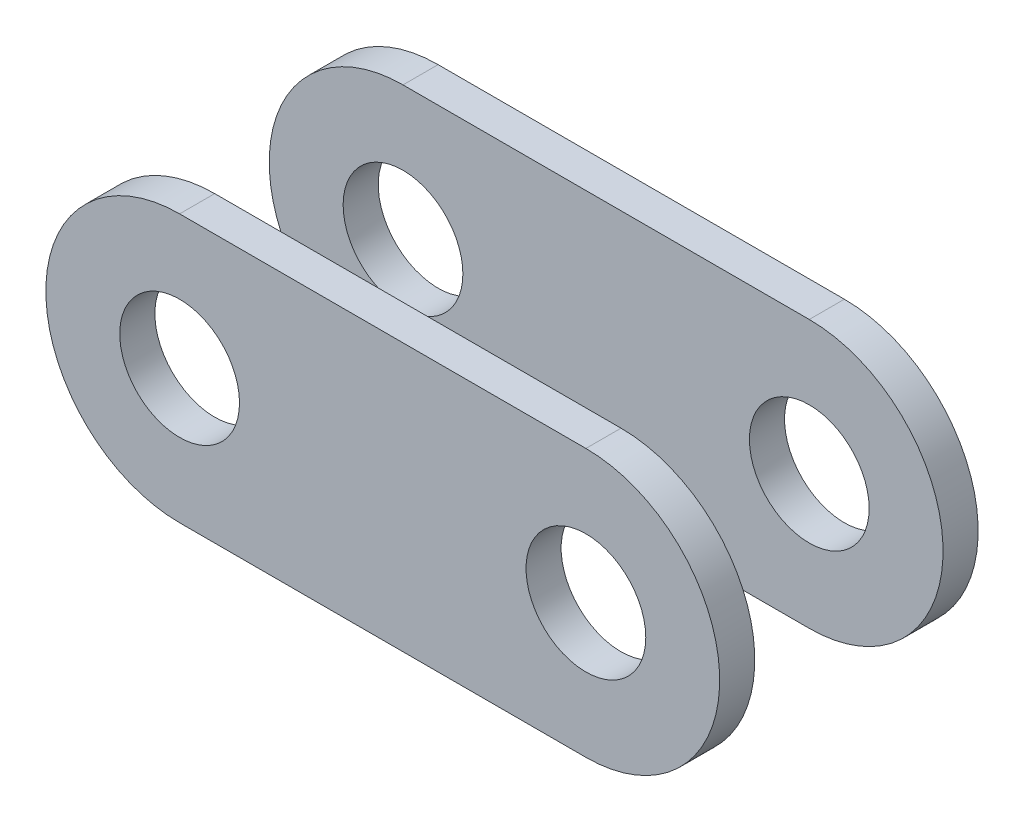
ISO-10303-21;
HEADER;
FILE_DESCRIPTION(('STEP AP214'),'2;1');
FILE_NAME('part.step','',(''),(''),'','','');
FILE_SCHEMA(('AUTOMOTIVE_DESIGN { 1 0 10303 214 1 1 1 1 }'));
ENDSEC;
DATA;
#1=APPLICATION_CONTEXT('core data for automotive mechanical design processes');
#2=APPLICATION_PROTOCOL_DEFINITION('international standard','automotive_design',2000,#1);
#3=PRODUCT_CONTEXT('',#1,'mechanical');
#4=PRODUCT('Part','Part','',(#3));
#5=PRODUCT_RELATED_PRODUCT_CATEGORY('part','',(#4));
#6=PRODUCT_DEFINITION_FORMATION('','',#4);
#7=PRODUCT_DEFINITION_CONTEXT('part definition',#1,'design');
#8=PRODUCT_DEFINITION('design','',#6,#7);
#9=PRODUCT_DEFINITION_SHAPE('','',#8);
#10=(LENGTH_UNIT() NAMED_UNIT(*) SI_UNIT(.MILLI.,.METRE.));
#11=(NAMED_UNIT(*) PLANE_ANGLE_UNIT() SI_UNIT($,.RADIAN.));
#12=(NAMED_UNIT(*) SI_UNIT($,.STERADIAN.) SOLID_ANGLE_UNIT());
#13=UNCERTAINTY_MEASURE_WITH_UNIT(LENGTH_MEASURE(1.E-05),#10,'distance_accuracy_value','');
#14=(GEOMETRIC_REPRESENTATION_CONTEXT(3) GLOBAL_UNCERTAINTY_ASSIGNED_CONTEXT((#13)) GLOBAL_UNIT_ASSIGNED_CONTEXT((#10,
#11,#12)) REPRESENTATION_CONTEXT('',''));
#15=CARTESIAN_POINT('',(0.,0.,0.));
#16=DIRECTION('',(0.,0.,1.));
#17=DIRECTION('',(1.,0.,0.));
#18=AXIS2_PLACEMENT_3D('',#15,#16,#17);
#19=CARTESIAN_POINT('',(-9.46580774929193,0.,-3.9751));
#20=DIRECTION('',(0.,0.,1.));
#21=DIRECTION('',(1.,0.,0.));
#22=AXIS2_PLACEMENT_3D('',#19,#20,#21);
#23=CYLINDRICAL_SURFACE('',#22,4.1148);
#24=CARTESIAN_POINT('',(-9.46580774929193,0.,-2.8956));
#25=DIRECTION('',(0.,0.,-1.));
#26=DIRECTION('',(-1.,0.,0.));
#27=AXIS2_PLACEMENT_3D('',#24,#25,#26);
#28=CIRCLE('',#27,4.1148);
#29=CARTESIAN_POINT('',(-9.46580774929193,4.1148,-2.8956));
#30=VERTEX_POINT('',#29);
#31=CARTESIAN_POINT('',(-9.46580774929193,-4.1148,-2.8956));
#32=VERTEX_POINT('',#31);
#33=EDGE_CURVE('E59',#30,#32,#28,.F.);
#34=ORIENTED_EDGE('',*,*,#33,.F.);
#35=DIRECTION('',(0.,0.,1.));
#36=VECTOR('',#35,1.);
#37=CARTESIAN_POINT('',(-9.46580774929193,4.1148,-3.9751));
#38=LINE('',#37,#36);
#39=CARTESIAN_POINT('',(-9.46580774929193,4.1148,-3.9751));
#40=VERTEX_POINT('',#39);
#41=EDGE_CURVE('E101',#40,#30,#38,.T.);
#42=ORIENTED_EDGE('',*,*,#41,.F.);
#43=CARTESIAN_POINT('',(-9.46580774929193,0.,-3.9751));
#44=DIRECTION('',(0.,0.,1.));
#45=DIRECTION('',(1.,0.,0.));
#46=AXIS2_PLACEMENT_3D('',#43,#44,#45);
#47=CIRCLE('',#46,4.1148);
#48=CARTESIAN_POINT('',(-9.46580774929193,-4.1148,-3.9751));
#49=VERTEX_POINT('',#48);
#50=EDGE_CURVE('E98',#40,#49,#47,.T.);
#51=ORIENTED_EDGE('',*,*,#50,.T.);
#52=DIRECTION('',(0.,0.,1.));
#53=VECTOR('',#52,1.);
#54=CARTESIAN_POINT('',(-9.46580774929193,-4.1148,-3.9751));
#55=LINE('',#54,#53);
#56=EDGE_CURVE('E46',#49,#32,#55,.T.);
#57=ORIENTED_EDGE('',*,*,#56,.T.);
#58=EDGE_LOOP('',(#34,#42,#51,#57));
#59=FACE_BOUND('',#58,.T.);
#60=ADVANCED_FACE('F42',(#59),#23,.T.);
#61=CARTESIAN_POINT('',(-9.46580774929193,4.1148,-3.9751));
#62=DIRECTION('',(0.,1.,0.));
#63=DIRECTION('',(0.,0.,1.));
#64=AXIS2_PLACEMENT_3D('',#61,#62,#63);
#65=PLANE('',#64);
#66=DIRECTION('',(-1.,0.,0.));
#67=VECTOR('',#66,1.);
#68=CARTESIAN_POINT('',(-13.5806077492919,4.1148,-2.8956));
#69=LINE('',#68,#67);
#70=CARTESIAN_POINT('',(3.03099225070807,4.1148,-2.8956));
#71=VERTEX_POINT('',#70);
#72=EDGE_CURVE('E12',#71,#30,#69,.T.);
#73=ORIENTED_EDGE('',*,*,#72,.F.);
#74=DIRECTION('',(0.,0.,1.));
#75=VECTOR('',#74,1.);
#76=CARTESIAN_POINT('',(3.03099225070807,4.1148,-3.9751));
#77=LINE('',#76,#75);
#78=CARTESIAN_POINT('',(3.03099225070807,4.1148,-3.9751));
#79=VERTEX_POINT('',#78);
#80=EDGE_CURVE('E94',#79,#71,#77,.T.);
#81=ORIENTED_EDGE('',*,*,#80,.F.);
#82=DIRECTION('',(-1.,0.,0.));
#83=VECTOR('',#82,1.);
#84=CARTESIAN_POINT('',(-9.46580774929193,4.1148,-3.9751));
#85=LINE('',#84,#83);
#86=EDGE_CURVE('E99',#79,#40,#85,.T.);
#87=ORIENTED_EDGE('',*,*,#86,.T.);
#88=ORIENTED_EDGE('',*,*,#41,.T.);
#89=EDGE_LOOP('',(#73,#81,#87,#88));
#90=FACE_BOUND('',#89,.T.);
#91=ADVANCED_FACE('F148',(#90),#65,.T.);
#92=CARTESIAN_POINT('',(3.03099225070807,0.,-3.9751));
#93=DIRECTION('',(0.,0.,1.));
#94=DIRECTION('',(1.,0.,0.));
#95=AXIS2_PLACEMENT_3D('',#92,#93,#94);
#96=CYLINDRICAL_SURFACE('',#95,4.1148);
#97=CARTESIAN_POINT('',(3.03099225070807,0.,-2.8956));
#98=DIRECTION('',(0.,0.,-1.));
#99=DIRECTION('',(-1.,0.,0.));
#100=AXIS2_PLACEMENT_3D('',#97,#98,#99);
#101=CIRCLE('',#100,4.1148);
#102=CARTESIAN_POINT('',(3.03099225070807,-4.1148,-2.8956));
#103=VERTEX_POINT('',#102);
#104=EDGE_CURVE('E52',#103,#71,#101,.F.);
#105=ORIENTED_EDGE('',*,*,#104,.F.);
#106=DIRECTION('',(0.,0.,1.));
#107=VECTOR('',#106,1.);
#108=CARTESIAN_POINT('',(3.03099225070807,-4.1148,-3.9751));
#109=LINE('',#108,#107);
#110=CARTESIAN_POINT('',(3.03099225070807,-4.1148,-3.9751));
#111=VERTEX_POINT('',#110);
#112=EDGE_CURVE('E92',#111,#103,#109,.T.);
#113=ORIENTED_EDGE('',*,*,#112,.F.);
#114=CARTESIAN_POINT('',(3.03099225070807,0.,-3.9751));
#115=DIRECTION('',(0.,0.,1.));
#116=DIRECTION('',(1.,0.,0.));
#117=AXIS2_PLACEMENT_3D('',#114,#115,#116);
#118=CIRCLE('',#117,4.1148);
#119=EDGE_CURVE('E118',#111,#79,#118,.T.);
#120=ORIENTED_EDGE('',*,*,#119,.T.);
#121=ORIENTED_EDGE('',*,*,#80,.T.);
#122=EDGE_LOOP('',(#105,#113,#120,#121));
#123=FACE_BOUND('',#122,.T.);
#124=ADVANCED_FACE('F153',(#123),#96,.T.);
#125=CARTESIAN_POINT('',(-9.46580774929193,-4.1148,-3.9751));
#126=DIRECTION('',(0.,-1.,0.));
#127=DIRECTION('',(0.,0.,-1.));
#128=AXIS2_PLACEMENT_3D('',#125,#126,#127);
#129=PLANE('',#128);
#130=DIRECTION('',(-1.,0.,0.));
#131=VECTOR('',#130,1.);
#132=CARTESIAN_POINT('',(-13.5806077492919,-4.1148,-2.8956));
#133=LINE('',#132,#131);
#134=EDGE_CURVE('E81',#103,#32,#133,.T.);
#135=ORIENTED_EDGE('',*,*,#134,.T.);
#136=ORIENTED_EDGE('',*,*,#56,.F.);
#137=DIRECTION('',(1.,0.,0.));
#138=VECTOR('',#137,1.);
#139=CARTESIAN_POINT('',(-9.46580774929193,-4.1148,-3.9751));
#140=LINE('',#139,#138);
#141=EDGE_CURVE('E93',#49,#111,#140,.T.);
#142=ORIENTED_EDGE('',*,*,#141,.T.);
#143=ORIENTED_EDGE('',*,*,#112,.T.);
#144=EDGE_LOOP('',(#135,#136,#142,#143));
#145=FACE_BOUND('',#144,.T.);
#146=ADVANCED_FACE('F89',(#145),#129,.T.);
#147=CARTESIAN_POINT('',(-9.46580774929193,0.,-3.9751));
#148=DIRECTION('',(0.,0.,1.));
#149=DIRECTION('',(1.,0.,0.));
#150=AXIS2_PLACEMENT_3D('',#147,#148,#149);
#151=CYLINDRICAL_SURFACE('',#150,1.8415);
#152=CARTESIAN_POINT('',(-9.46580774929193,0.,-2.8956));
#153=DIRECTION('',(0.,0.,-1.));
#154=DIRECTION('',(-1.,0.,0.));
#155=AXIS2_PLACEMENT_3D('',#152,#153,#154);
#156=CIRCLE('',#155,1.8415);
#157=CARTESIAN_POINT('',(-11.3073077492919,0.,-2.8956));
#158=VERTEX_POINT('',#157);
#159=EDGE_CURVE('E114',#158,#158,#156,.F.);
#160=ORIENTED_EDGE('',*,*,#159,.T.);
#161=EDGE_LOOP('',(#160));
#162=FACE_BOUND('',#161,.T.);
#163=CARTESIAN_POINT('',(-9.46580774929193,0.,-3.9751));
#164=DIRECTION('',(0.,0.,1.));
#165=DIRECTION('',(1.,0.,0.));
#166=AXIS2_PLACEMENT_3D('',#163,#164,#165);
#167=CIRCLE('',#166,1.8415);
#168=CARTESIAN_POINT('',(-7.62430774929193,0.,-3.9751));
#169=VERTEX_POINT('',#168);
#170=EDGE_CURVE('E85',#169,#169,#167,.T.);
#171=ORIENTED_EDGE('',*,*,#170,.F.);
#172=EDGE_LOOP('',(#171));
#173=FACE_BOUND('',#172,.T.);
#174=ADVANCED_FACE('F136',(#162,#173),#151,.F.);
#175=CARTESIAN_POINT('',(3.03099225070807,0.,-3.9751));
#176=DIRECTION('',(0.,0.,1.));
#177=DIRECTION('',(1.,0.,0.));
#178=AXIS2_PLACEMENT_3D('',#175,#176,#177);
#179=CYLINDRICAL_SURFACE('',#178,1.8415);
#180=CARTESIAN_POINT('',(3.03099225070807,0.,-2.8956));
#181=DIRECTION('',(0.,0.,-1.));
#182=DIRECTION('',(-1.,0.,0.));
#183=AXIS2_PLACEMENT_3D('',#180,#181,#182);
#184=CIRCLE('',#183,1.8415);
#185=CARTESIAN_POINT('',(1.18949225070807,0.,-2.8956));
#186=VERTEX_POINT('',#185);
#187=EDGE_CURVE('E111',#186,#186,#184,.F.);
#188=ORIENTED_EDGE('',*,*,#187,.T.);
#189=EDGE_LOOP('',(#188));
#190=FACE_BOUND('',#189,.T.);
#191=CARTESIAN_POINT('',(3.03099225070807,0.,-3.9751));
#192=DIRECTION('',(0.,0.,1.));
#193=DIRECTION('',(1.,0.,0.));
#194=AXIS2_PLACEMENT_3D('',#191,#192,#193);
#195=CIRCLE('',#194,1.8415);
#196=CARTESIAN_POINT('',(4.87249225070807,0.,-3.9751));
#197=VERTEX_POINT('',#196);
#198=EDGE_CURVE('E109',#197,#197,#195,.T.);
#199=ORIENTED_EDGE('',*,*,#198,.F.);
#200=EDGE_LOOP('',(#199));
#201=FACE_BOUND('',#200,.T.);
#202=ADVANCED_FACE('F44',(#190,#201),#179,.F.);
#203=CARTESIAN_POINT('',(-9.46580774929193,0.,-3.9751));
#204=DIRECTION('',(0.,0.,1.));
#205=DIRECTION('',(1.,0.,0.));
#206=AXIS2_PLACEMENT_3D('',#203,#204,#205);
#207=PLANE('',#206);
#208=ORIENTED_EDGE('',*,*,#198,.T.);
#209=EDGE_LOOP('',(#208));
#210=FACE_BOUND('',#209,.T.);
#211=ORIENTED_EDGE('',*,*,#170,.T.);
#212=EDGE_LOOP('',(#211));
#213=FACE_BOUND('',#212,.T.);
#214=ORIENTED_EDGE('',*,*,#50,.F.);
#215=ORIENTED_EDGE('',*,*,#86,.F.);
#216=ORIENTED_EDGE('',*,*,#119,.F.);
#217=ORIENTED_EDGE('',*,*,#141,.F.);
#218=EDGE_LOOP('',(#214,#215,#216,#217));
#219=FACE_BOUND('',#218,.T.);
#220=ADVANCED_FACE('F122',(#210,#213,#219),#207,.F.);
#221=CARTESIAN_POINT('',(-13.5806077492919,-4.1148,-2.8956));
#222=DIRECTION('',(0.,0.,-1.));
#223=DIRECTION('',(-1.,0.,0.));
#224=AXIS2_PLACEMENT_3D('',#221,#222,#223);
#225=PLANE('',#224);
#226=ORIENTED_EDGE('',*,*,#33,.T.);
#227=ORIENTED_EDGE('',*,*,#134,.F.);
#228=ORIENTED_EDGE('',*,*,#104,.T.);
#229=ORIENTED_EDGE('',*,*,#72,.T.);
#230=EDGE_LOOP('',(#226,#227,#228,#229));
#231=FACE_BOUND('',#230,.T.);
#232=ORIENTED_EDGE('',*,*,#187,.F.);
#233=EDGE_LOOP('',(#232));
#234=FACE_BOUND('',#233,.T.);
#235=ORIENTED_EDGE('',*,*,#159,.F.);
#236=EDGE_LOOP('',(#235));
#237=FACE_BOUND('',#236,.T.);
#238=ADVANCED_FACE('F79',(#231,#234,#237),#225,.F.);
#239=CLOSED_SHELL('',(#60,#91,#124,#146,#174,#202,#220,#238));
#240=MANIFOLD_SOLID_BREP('B2',#239);
#241=CARTESIAN_POINT('',(-9.46580774929193,-4.1148,-3.9751));
#242=DIRECTION('',(0.,-1.,0.));
#243=DIRECTION('',(0.,0.,-1.));
#244=AXIS2_PLACEMENT_3D('',#241,#242,#243);
#245=PLANE('',#244);
#246=DIRECTION('',(1.,0.,0.));
#247=VECTOR('',#246,1.);
#248=CARTESIAN_POINT('',(-13.5806077492919,-4.1148,2.8956));
#249=LINE('',#248,#247);
#250=CARTESIAN_POINT('',(-9.46580774929193,-4.1148,2.8956));
#251=VERTEX_POINT('',#250);
#252=CARTESIAN_POINT('',(3.03099225070807,-4.1148,2.8956));
#253=VERTEX_POINT('',#252);
#254=EDGE_CURVE('E253',#251,#253,#249,.T.);
#255=ORIENTED_EDGE('',*,*,#254,.T.);
#256=DIRECTION('',(0.,0.,1.));
#257=VECTOR('',#256,1.);
#258=CARTESIAN_POINT('',(3.03099225070807,-4.1148,-3.9751));
#259=LINE('',#258,#257);
#260=CARTESIAN_POINT('',(3.03099225070807,-4.1148,3.9751));
#261=VERTEX_POINT('',#260);
#262=EDGE_CURVE('E281',#253,#261,#259,.T.);
#263=ORIENTED_EDGE('',*,*,#262,.T.);
#264=DIRECTION('',(1.,0.,0.));
#265=VECTOR('',#264,1.);
#266=CARTESIAN_POINT('',(-9.46580774929193,-4.1148,3.9751));
#267=LINE('',#266,#265);
#268=CARTESIAN_POINT('',(-9.46580774929193,-4.1148,3.9751));
#269=VERTEX_POINT('',#268);
#270=EDGE_CURVE('E267',#269,#261,#267,.T.);
#271=ORIENTED_EDGE('',*,*,#270,.F.);
#272=DIRECTION('',(0.,0.,1.));
#273=VECTOR('',#272,1.);
#274=CARTESIAN_POINT('',(-9.46580774929193,-4.1148,-3.9751));
#275=LINE('',#274,#273);
#276=EDGE_CURVE('E263',#251,#269,#275,.T.);
#277=ORIENTED_EDGE('',*,*,#276,.F.);
#278=EDGE_LOOP('',(#255,#263,#271,#277));
#279=FACE_BOUND('',#278,.T.);
#280=ADVANCED_FACE('F207',(#279),#245,.T.);
#281=CARTESIAN_POINT('',(3.03099225070807,0.,-3.9751));
#282=DIRECTION('',(0.,0.,1.));
#283=DIRECTION('',(1.,0.,0.));
#284=AXIS2_PLACEMENT_3D('',#281,#282,#283);
#285=CYLINDRICAL_SURFACE('',#284,4.1148);
#286=CARTESIAN_POINT('',(3.03099225070807,0.,2.8956));
#287=DIRECTION('',(0.,0.,1.));
#288=DIRECTION('',(1.,0.,0.));
#289=AXIS2_PLACEMENT_3D('',#286,#287,#288);
#290=CIRCLE('',#289,4.1148);
#291=CARTESIAN_POINT('',(3.03099225070807,4.1148,2.8956));
#292=VERTEX_POINT('',#291);
#293=EDGE_CURVE('E224',#292,#253,#290,.F.);
#294=ORIENTED_EDGE('',*,*,#293,.F.);
#295=DIRECTION('',(0.,0.,1.));
#296=VECTOR('',#295,1.);
#297=CARTESIAN_POINT('',(3.03099225070807,4.1148,-3.9751));
#298=LINE('',#297,#296);
#299=CARTESIAN_POINT('',(3.03099225070807,4.1148,3.9751));
#300=VERTEX_POINT('',#299);
#301=EDGE_CURVE('E216',#292,#300,#298,.T.);
#302=ORIENTED_EDGE('',*,*,#301,.T.);
#303=CARTESIAN_POINT('',(3.03099225070807,0.,3.9751));
#304=DIRECTION('',(0.,0.,1.));
#305=DIRECTION('',(1.,0.,0.));
#306=AXIS2_PLACEMENT_3D('',#303,#304,#305);
#307=CIRCLE('',#306,4.1148);
#308=EDGE_CURVE('E270',#261,#300,#307,.T.);
#309=ORIENTED_EDGE('',*,*,#308,.F.);
#310=ORIENTED_EDGE('',*,*,#262,.F.);
#311=EDGE_LOOP('',(#294,#302,#309,#310));
#312=FACE_BOUND('',#311,.T.);
#313=ADVANCED_FACE('F288',(#312),#285,.T.);
#314=CARTESIAN_POINT('',(-9.46580774929193,4.1148,-3.9751));
#315=DIRECTION('',(0.,1.,0.));
#316=DIRECTION('',(0.,0.,1.));
#317=AXIS2_PLACEMENT_3D('',#314,#315,#316);
#318=PLANE('',#317);
#319=DIRECTION('',(1.,0.,0.));
#320=VECTOR('',#319,1.);
#321=CARTESIAN_POINT('',(-13.5806077492919,4.1148,2.8956));
#322=LINE('',#321,#320);
#323=CARTESIAN_POINT('',(-9.46580774929193,4.1148,2.8956));
#324=VERTEX_POINT('',#323);
#325=EDGE_CURVE('E251',#324,#292,#322,.T.);
#326=ORIENTED_EDGE('',*,*,#325,.F.);
#327=DIRECTION('',(0.,0.,1.));
#328=VECTOR('',#327,1.);
#329=CARTESIAN_POINT('',(-9.46580774929193,4.1148,-3.9751));
#330=LINE('',#329,#328);
#331=CARTESIAN_POINT('',(-9.46580774929193,4.1148,3.9751));
#332=VERTEX_POINT('',#331);
#333=EDGE_CURVE('E40',#324,#332,#330,.T.);
#334=ORIENTED_EDGE('',*,*,#333,.T.);
#335=DIRECTION('',(-1.,0.,0.));
#336=VECTOR('',#335,1.);
#337=CARTESIAN_POINT('',(-9.46580774929193,4.1148,3.9751));
#338=LINE('',#337,#336);
#339=EDGE_CURVE('E278',#300,#332,#338,.T.);
#340=ORIENTED_EDGE('',*,*,#339,.F.);
#341=ORIENTED_EDGE('',*,*,#301,.F.);
#342=EDGE_LOOP('',(#326,#334,#340,#341));
#343=FACE_BOUND('',#342,.T.);
#344=ADVANCED_FACE('F258',(#343),#318,.T.);
#345=CARTESIAN_POINT('',(-9.46580774929193,0.,-3.9751));
#346=DIRECTION('',(0.,0.,1.));
#347=DIRECTION('',(1.,0.,0.));
#348=AXIS2_PLACEMENT_3D('',#345,#346,#347);
#349=CYLINDRICAL_SURFACE('',#348,4.1148);
#350=CARTESIAN_POINT('',(-9.46580774929193,0.,2.8956));
#351=DIRECTION('',(0.,0.,1.));
#352=DIRECTION('',(1.,0.,0.));
#353=AXIS2_PLACEMENT_3D('',#350,#351,#352);
#354=CIRCLE('',#353,4.1148);
#355=EDGE_CURVE('E248',#251,#324,#354,.F.);
#356=ORIENTED_EDGE('',*,*,#355,.F.);
#357=ORIENTED_EDGE('',*,*,#276,.T.);
#358=CARTESIAN_POINT('',(-9.46580774929193,0.,3.9751));
#359=DIRECTION('',(0.,0.,1.));
#360=DIRECTION('',(1.,0.,0.));
#361=AXIS2_PLACEMENT_3D('',#358,#359,#360);
#362=CIRCLE('',#361,4.1148);
#363=EDGE_CURVE('E262',#332,#269,#362,.T.);
#364=ORIENTED_EDGE('',*,*,#363,.F.);
#365=ORIENTED_EDGE('',*,*,#333,.F.);
#366=EDGE_LOOP('',(#356,#357,#364,#365));
#367=FACE_BOUND('',#366,.T.);
#368=ADVANCED_FACE('F209',(#367),#349,.T.);
#369=CARTESIAN_POINT('',(-9.46580774929193,0.,-3.9751));
#370=DIRECTION('',(0.,0.,1.));
#371=DIRECTION('',(1.,0.,0.));
#372=AXIS2_PLACEMENT_3D('',#369,#370,#371);
#373=CYLINDRICAL_SURFACE('',#372,1.8415);
#374=CARTESIAN_POINT('',(-9.46580774929193,0.,2.8956));
#375=DIRECTION('',(0.,0.,1.));
#376=DIRECTION('',(1.,0.,0.));
#377=AXIS2_PLACEMENT_3D('',#374,#375,#376);
#378=CIRCLE('',#377,1.8415);
#379=CARTESIAN_POINT('',(-7.62430774929193,0.,2.8956));
#380=VERTEX_POINT('',#379);
#381=EDGE_CURVE('E289',#380,#380,#378,.F.);
#382=ORIENTED_EDGE('',*,*,#381,.T.);
#383=EDGE_LOOP('',(#382));
#384=FACE_BOUND('',#383,.T.);
#385=CARTESIAN_POINT('',(-9.46580774929193,0.,3.9751));
#386=DIRECTION('',(0.,0.,1.));
#387=DIRECTION('',(1.,0.,0.));
#388=AXIS2_PLACEMENT_3D('',#385,#386,#387);
#389=CIRCLE('',#388,1.8415);
#390=CARTESIAN_POINT('',(-7.62430774929193,0.,3.9751));
#391=VERTEX_POINT('',#390);
#392=EDGE_CURVE('E268',#391,#391,#389,.T.);
#393=ORIENTED_EDGE('',*,*,#392,.T.);
#394=EDGE_LOOP('',(#393));
#395=FACE_BOUND('',#394,.T.);
#396=ADVANCED_FACE('F298',(#384,#395),#373,.F.);
#397=CARTESIAN_POINT('',(-9.46580774929193,0.,3.9751));
#398=DIRECTION('',(0.,0.,1.));
#399=DIRECTION('',(1.,0.,0.));
#400=AXIS2_PLACEMENT_3D('',#397,#398,#399);
#401=PLANE('',#400);
#402=ORIENTED_EDGE('',*,*,#392,.F.);
#403=EDGE_LOOP('',(#402));
#404=FACE_BOUND('',#403,.T.);
#405=ORIENTED_EDGE('',*,*,#363,.T.);
#406=ORIENTED_EDGE('',*,*,#270,.T.);
#407=ORIENTED_EDGE('',*,*,#308,.T.);
#408=ORIENTED_EDGE('',*,*,#339,.T.);
#409=EDGE_LOOP('',(#405,#406,#407,#408));
#410=FACE_BOUND('',#409,.T.);
#411=CARTESIAN_POINT('',(3.03099225070807,0.,3.9751));
#412=DIRECTION('',(0.,0.,1.));
#413=DIRECTION('',(1.,0.,0.));
#414=AXIS2_PLACEMENT_3D('',#411,#412,#413);
#415=CIRCLE('',#414,1.8415);
#416=CARTESIAN_POINT('',(4.87249225070807,0.,3.9751));
#417=VERTEX_POINT('',#416);
#418=EDGE_CURVE('E256',#417,#417,#415,.T.);
#419=ORIENTED_EDGE('',*,*,#418,.F.);
#420=EDGE_LOOP('',(#419));
#421=FACE_BOUND('',#420,.T.);
#422=ADVANCED_FACE('F286',(#404,#410,#421),#401,.T.);
#423=CARTESIAN_POINT('',(3.03099225070807,0.,-3.9751));
#424=DIRECTION('',(0.,0.,1.));
#425=DIRECTION('',(1.,0.,0.));
#426=AXIS2_PLACEMENT_3D('',#423,#424,#425);
#427=CYLINDRICAL_SURFACE('',#426,1.8415);
#428=CARTESIAN_POINT('',(3.03099225070807,0.,2.8956));
#429=DIRECTION('',(0.,0.,1.));
#430=DIRECTION('',(1.,0.,0.));
#431=AXIS2_PLACEMENT_3D('',#428,#429,#430);
#432=CIRCLE('',#431,1.8415);
#433=CARTESIAN_POINT('',(4.87249225070807,0.,2.8956));
#434=VERTEX_POINT('',#433);
#435=EDGE_CURVE('E211',#434,#434,#432,.F.);
#436=ORIENTED_EDGE('',*,*,#435,.T.);
#437=EDGE_LOOP('',(#436));
#438=FACE_BOUND('',#437,.T.);
#439=ORIENTED_EDGE('',*,*,#418,.T.);
#440=EDGE_LOOP('',(#439));
#441=FACE_BOUND('',#440,.T.);
#442=ADVANCED_FACE('F296',(#438,#441),#427,.F.);
#443=CARTESIAN_POINT('',(-13.5806077492919,-4.1148,2.8956));
#444=DIRECTION('',(0.,0.,1.));
#445=DIRECTION('',(1.,0.,0.));
#446=AXIS2_PLACEMENT_3D('',#443,#444,#445);
#447=PLANE('',#446);
#448=ORIENTED_EDGE('',*,*,#355,.T.);
#449=ORIENTED_EDGE('',*,*,#325,.T.);
#450=ORIENTED_EDGE('',*,*,#293,.T.);
#451=ORIENTED_EDGE('',*,*,#254,.F.);
#452=EDGE_LOOP('',(#448,#449,#450,#451));
#453=FACE_BOUND('',#452,.T.);
#454=ORIENTED_EDGE('',*,*,#435,.F.);
#455=EDGE_LOOP('',(#454));
#456=FACE_BOUND('',#455,.T.);
#457=ORIENTED_EDGE('',*,*,#381,.F.);
#458=EDGE_LOOP('',(#457));
#459=FACE_BOUND('',#458,.T.);
#460=ADVANCED_FACE('F249',(#453,#456,#459),#447,.F.);
#461=CLOSED_SHELL('',(#280,#313,#344,#368,#396,#422,#442,#460));
#462=MANIFOLD_SOLID_BREP('B6',#461);
#463=ADVANCED_BREP_SHAPE_REPRESENTATION('',(#18,#240,#462),#14);
#464=SHAPE_DEFINITION_REPRESENTATION(#9,#463);
ENDSEC;
END-ISO-10303-21;
